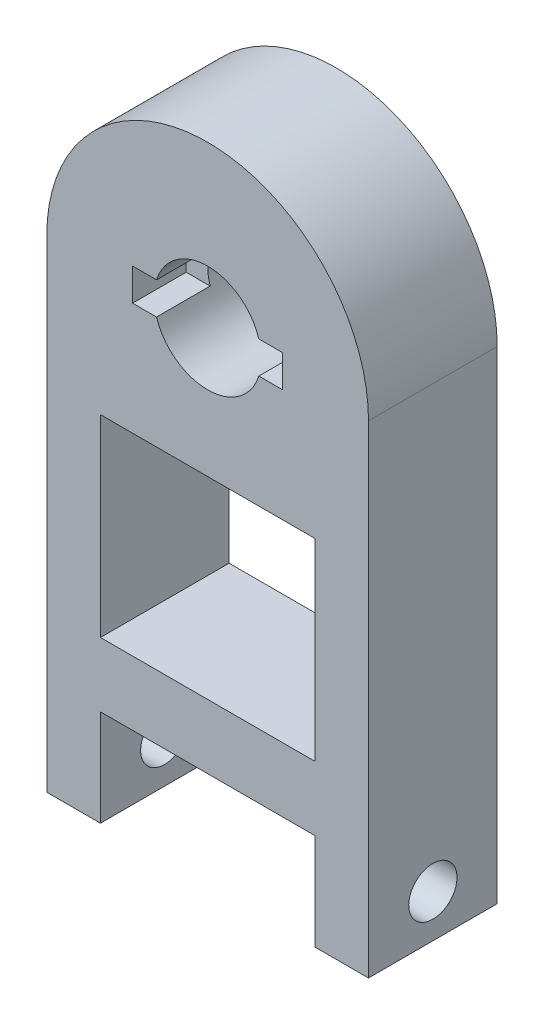
ISO-10303-21;
HEADER;
FILE_DESCRIPTION(('STEP AP214'),'2;1');
FILE_NAME('part.step','',(''),(''),'','','');
FILE_SCHEMA(('AUTOMOTIVE_DESIGN { 1 0 10303 214 1 1 1 1 }'));
ENDSEC;
DATA;
#1=APPLICATION_CONTEXT('core data for automotive mechanical design processes');
#2=APPLICATION_PROTOCOL_DEFINITION('international standard','automotive_design',2000,#1);
#3=PRODUCT_CONTEXT('',#1,'mechanical');
#4=PRODUCT('Part','Part','',(#3));
#5=PRODUCT_RELATED_PRODUCT_CATEGORY('part','',(#4));
#6=PRODUCT_DEFINITION_FORMATION('','',#4);
#7=PRODUCT_DEFINITION_CONTEXT('part definition',#1,'design');
#8=PRODUCT_DEFINITION('design','',#6,#7);
#9=PRODUCT_DEFINITION_SHAPE('','',#8);
#10=(LENGTH_UNIT() NAMED_UNIT(*) SI_UNIT(.MILLI.,.METRE.));
#11=(NAMED_UNIT(*) PLANE_ANGLE_UNIT() SI_UNIT($,.RADIAN.));
#12=(NAMED_UNIT(*) SI_UNIT($,.STERADIAN.) SOLID_ANGLE_UNIT());
#13=UNCERTAINTY_MEASURE_WITH_UNIT(LENGTH_MEASURE(1.E-05),#10,'distance_accuracy_value','');
#14=(GEOMETRIC_REPRESENTATION_CONTEXT(3) GLOBAL_UNCERTAINTY_ASSIGNED_CONTEXT((#13)) GLOBAL_UNIT_ASSIGNED_CONTEXT((#10,
#11,#12)) REPRESENTATION_CONTEXT('',''));
#15=CARTESIAN_POINT('',(0.,0.,0.));
#16=DIRECTION('',(0.,0.,1.));
#17=DIRECTION('',(1.,0.,0.));
#18=AXIS2_PLACEMENT_3D('',#15,#16,#17);
#19=CARTESIAN_POINT('',(0.,45.,12.));
#20=DIRECTION('',(0.,0.,1.));
#21=DIRECTION('',(1.,0.,0.));
#22=AXIS2_PLACEMENT_3D('',#19,#20,#21);
#23=PLANE('',#22);
#24=DIRECTION('',(-1.,0.,0.));
#25=VECTOR('',#24,1.);
#26=CARTESIAN_POINT('',(-7.,46.5,12.));
#27=LINE('',#26,#25);
#28=CARTESIAN_POINT('',(-4.76969600708473,46.5,12.));
#29=VERTEX_POINT('',#28);
#30=CARTESIAN_POINT('',(-7.,46.5,12.));
#31=VERTEX_POINT('',#30);
#32=EDGE_CURVE('E193',#29,#31,#27,.T.);
#33=ORIENTED_EDGE('',*,*,#32,.F.);
#34=CARTESIAN_POINT('',(0.,45.,12.));
#35=DIRECTION('',(0.,0.,1.));
#36=DIRECTION('',(1.,0.,0.));
#37=AXIS2_PLACEMENT_3D('',#34,#35,#36);
#38=CIRCLE('',#37,5.);
#39=CARTESIAN_POINT('',(4.76969600708473,46.5,12.));
#40=VERTEX_POINT('',#39);
#41=EDGE_CURVE('E224',#40,#29,#38,.T.);
#42=ORIENTED_EDGE('',*,*,#41,.F.);
#43=CARTESIAN_POINT('',(7.,46.5,12.));
#44=VERTEX_POINT('',#43);
#45=EDGE_CURVE('E191',#44,#40,#27,.T.);
#46=ORIENTED_EDGE('',*,*,#45,.F.);
#47=DIRECTION('',(0.,1.,0.));
#48=VECTOR('',#47,1.);
#49=CARTESIAN_POINT('',(7.,46.5,12.));
#50=LINE('',#49,#48);
#51=CARTESIAN_POINT('',(7.,43.5,12.));
#52=VERTEX_POINT('',#51);
#53=EDGE_CURVE('E202',#52,#44,#50,.T.);
#54=ORIENTED_EDGE('',*,*,#53,.F.);
#55=DIRECTION('',(1.,0.,0.));
#56=VECTOR('',#55,1.);
#57=CARTESIAN_POINT('',(-7.,43.5,12.));
#58=LINE('',#57,#56);
#59=CARTESIAN_POINT('',(4.76969600708473,43.5,12.));
#60=VERTEX_POINT('',#59);
#61=EDGE_CURVE('E199',#60,#52,#58,.T.);
#62=ORIENTED_EDGE('',*,*,#61,.F.);
#63=CARTESIAN_POINT('',(-4.76969600708473,43.5,12.));
#64=VERTEX_POINT('',#63);
#65=EDGE_CURVE('E228',#64,#60,#38,.T.);
#66=ORIENTED_EDGE('',*,*,#65,.F.);
#67=CARTESIAN_POINT('',(-7.,43.5,12.));
#68=VERTEX_POINT('',#67);
#69=EDGE_CURVE('E200',#68,#64,#58,.T.);
#70=ORIENTED_EDGE('',*,*,#69,.F.);
#71=DIRECTION('',(0.,-1.,0.));
#72=VECTOR('',#71,1.);
#73=CARTESIAN_POINT('',(-7.,46.5,12.));
#74=LINE('',#73,#72);
#75=EDGE_CURVE('E176',#31,#68,#74,.T.);
#76=ORIENTED_EDGE('',*,*,#75,.F.);
#77=EDGE_LOOP('',(#33,#42,#46,#54,#62,#66,#70,#76));
#78=FACE_BOUND('',#77,.T.);
#79=DIRECTION('',(1.,0.,0.));
#80=VECTOR('',#79,1.);
#81=CARTESIAN_POINT('',(-9.99999999999999,15.,12.));
#82=LINE('',#81,#80);
#83=CARTESIAN_POINT('',(-9.99999999999999,15.,12.));
#84=VERTEX_POINT('',#83);
#85=CARTESIAN_POINT('',(10.,15.,12.));
#86=VERTEX_POINT('',#85);
#87=EDGE_CURVE('E233',#84,#86,#82,.T.);
#88=ORIENTED_EDGE('',*,*,#87,.F.);
#89=DIRECTION('',(0.,-1.,0.));
#90=VECTOR('',#89,1.);
#91=CARTESIAN_POINT('',(-9.99999999999999,33.,12.));
#92=LINE('',#91,#90);
#93=CARTESIAN_POINT('',(-9.99999999999999,33.,12.));
#94=VERTEX_POINT('',#93);
#95=EDGE_CURVE('E231',#94,#84,#92,.T.);
#96=ORIENTED_EDGE('',*,*,#95,.F.);
#97=DIRECTION('',(-1.,0.,0.));
#98=VECTOR('',#97,1.);
#99=CARTESIAN_POINT('',(-9.99999999999999,33.,12.));
#100=LINE('',#99,#98);
#101=CARTESIAN_POINT('',(10.,33.,12.));
#102=VERTEX_POINT('',#101);
#103=EDGE_CURVE('E239',#102,#94,#100,.T.);
#104=ORIENTED_EDGE('',*,*,#103,.F.);
#105=DIRECTION('',(0.,1.,0.));
#106=VECTOR('',#105,1.);
#107=CARTESIAN_POINT('',(10.,33.,12.));
#108=LINE('',#107,#106);
#109=EDGE_CURVE('E236',#86,#102,#108,.T.);
#110=ORIENTED_EDGE('',*,*,#109,.F.);
#111=EDGE_LOOP('',(#88,#96,#104,#110));
#112=FACE_BOUND('',#111,.T.);
#113=CARTESIAN_POINT('',(0.,45.,12.));
#114=DIRECTION('',(0.,0.,1.));
#115=DIRECTION('',(1.,0.,0.));
#116=AXIS2_PLACEMENT_3D('',#113,#114,#115);
#117=CIRCLE('',#116,15.);
#118=CARTESIAN_POINT('',(15.,45.,12.));
#119=VERTEX_POINT('',#118);
#120=CARTESIAN_POINT('',(-15.,45.,12.));
#121=VERTEX_POINT('',#120);
#122=EDGE_CURVE('E262',#119,#121,#117,.T.);
#123=ORIENTED_EDGE('',*,*,#122,.T.);
#124=DIRECTION('',(0.,-1.,0.));
#125=VECTOR('',#124,1.);
#126=CARTESIAN_POINT('',(-15.,45.,12.));
#127=LINE('',#126,#125);
#128=CARTESIAN_POINT('',(-15.,0.,12.));
#129=VERTEX_POINT('',#128);
#130=EDGE_CURVE('E265',#121,#129,#127,.T.);
#131=ORIENTED_EDGE('',*,*,#130,.T.);
#132=DIRECTION('',(1.,0.,0.));
#133=VECTOR('',#132,1.);
#134=CARTESIAN_POINT('',(-15.,0.,12.));
#135=LINE('',#134,#133);
#136=CARTESIAN_POINT('',(-9.99999999999999,0.,12.));
#137=VERTEX_POINT('',#136);
#138=EDGE_CURVE('E268',#129,#137,#135,.T.);
#139=ORIENTED_EDGE('',*,*,#138,.T.);
#140=DIRECTION('',(0.,1.,0.));
#141=VECTOR('',#140,1.);
#142=CARTESIAN_POINT('',(-9.99999999999999,0.,12.));
#143=LINE('',#142,#141);
#144=CARTESIAN_POINT('',(-9.99999999999999,9.,12.));
#145=VERTEX_POINT('',#144);
#146=EDGE_CURVE('E270',#137,#145,#143,.T.);
#147=ORIENTED_EDGE('',*,*,#146,.T.);
#148=DIRECTION('',(1.,0.,0.));
#149=VECTOR('',#148,1.);
#150=CARTESIAN_POINT('',(-9.99999999999999,9.,12.));
#151=LINE('',#150,#149);
#152=CARTESIAN_POINT('',(10.,9.,12.));
#153=VERTEX_POINT('',#152);
#154=EDGE_CURVE('E272',#145,#153,#151,.T.);
#155=ORIENTED_EDGE('',*,*,#154,.T.);
#156=DIRECTION('',(0.,-1.,0.));
#157=VECTOR('',#156,1.);
#158=CARTESIAN_POINT('',(10.,9.,12.));
#159=LINE('',#158,#157);
#160=CARTESIAN_POINT('',(10.,0.,12.));
#161=VERTEX_POINT('',#160);
#162=EDGE_CURVE('E274',#153,#161,#159,.T.);
#163=ORIENTED_EDGE('',*,*,#162,.T.);
#164=DIRECTION('',(1.,0.,0.));
#165=VECTOR('',#164,1.);
#166=CARTESIAN_POINT('',(10.,0.,12.));
#167=LINE('',#166,#165);
#168=CARTESIAN_POINT('',(15.,0.,12.));
#169=VERTEX_POINT('',#168);
#170=EDGE_CURVE('E276',#161,#169,#167,.T.);
#171=ORIENTED_EDGE('',*,*,#170,.T.);
#172=DIRECTION('',(0.,1.,0.));
#173=VECTOR('',#172,1.);
#174=CARTESIAN_POINT('',(15.,45.,12.));
#175=LINE('',#174,#173);
#176=EDGE_CURVE('E278',#169,#119,#175,.T.);
#177=ORIENTED_EDGE('',*,*,#176,.T.);
#178=EDGE_LOOP('',(#123,#131,#139,#147,#155,#163,#171,#177));
#179=FACE_BOUND('',#178,.T.);
#180=ADVANCED_FACE('F33',(#78,#112,#179),#23,.T.);
#181=CARTESIAN_POINT('',(0.,45.,0.));
#182=DIRECTION('',(0.,0.,1.));
#183=DIRECTION('',(1.,0.,0.));
#184=AXIS2_PLACEMENT_3D('',#181,#182,#183);
#185=PLANE('',#184);
#186=CARTESIAN_POINT('',(0.,45.,0.));
#187=DIRECTION('',(0.,0.,1.));
#188=DIRECTION('',(1.,0.,0.));
#189=AXIS2_PLACEMENT_3D('',#186,#187,#188);
#190=CIRCLE('',#189,15.);
#191=CARTESIAN_POINT('',(15.,45.,0.));
#192=VERTEX_POINT('',#191);
#193=CARTESIAN_POINT('',(-15.,45.,0.));
#194=VERTEX_POINT('',#193);
#195=EDGE_CURVE('E261',#192,#194,#190,.T.);
#196=ORIENTED_EDGE('',*,*,#195,.F.);
#197=DIRECTION('',(0.,1.,0.));
#198=VECTOR('',#197,1.);
#199=CARTESIAN_POINT('',(15.,45.,0.));
#200=LINE('',#199,#198);
#201=CARTESIAN_POINT('',(15.,0.,0.));
#202=VERTEX_POINT('',#201);
#203=EDGE_CURVE('E266',#202,#192,#200,.T.);
#204=ORIENTED_EDGE('',*,*,#203,.F.);
#205=DIRECTION('',(1.,0.,0.));
#206=VECTOR('',#205,1.);
#207=CARTESIAN_POINT('',(10.,0.,0.));
#208=LINE('',#207,#206);
#209=CARTESIAN_POINT('',(10.,0.,0.));
#210=VERTEX_POINT('',#209);
#211=EDGE_CURVE('E293',#210,#202,#208,.T.);
#212=ORIENTED_EDGE('',*,*,#211,.F.);
#213=DIRECTION('',(0.,-1.,0.));
#214=VECTOR('',#213,1.);
#215=CARTESIAN_POINT('',(10.,9.,0.));
#216=LINE('',#215,#214);
#217=CARTESIAN_POINT('',(10.,9.,0.));
#218=VERTEX_POINT('',#217);
#219=EDGE_CURVE('E291',#218,#210,#216,.T.);
#220=ORIENTED_EDGE('',*,*,#219,.F.);
#221=DIRECTION('',(1.,0.,0.));
#222=VECTOR('',#221,1.);
#223=CARTESIAN_POINT('',(-9.99999999999999,9.,0.));
#224=LINE('',#223,#222);
#225=CARTESIAN_POINT('',(-9.99999999999999,9.,0.));
#226=VERTEX_POINT('',#225);
#227=EDGE_CURVE('E289',#226,#218,#224,.T.);
#228=ORIENTED_EDGE('',*,*,#227,.F.);
#229=DIRECTION('',(0.,1.,0.));
#230=VECTOR('',#229,1.);
#231=CARTESIAN_POINT('',(-9.99999999999999,0.,0.));
#232=LINE('',#231,#230);
#233=CARTESIAN_POINT('',(-9.99999999999999,0.,0.));
#234=VERTEX_POINT('',#233);
#235=EDGE_CURVE('E287',#234,#226,#232,.T.);
#236=ORIENTED_EDGE('',*,*,#235,.F.);
#237=DIRECTION('',(1.,0.,0.));
#238=VECTOR('',#237,1.);
#239=CARTESIAN_POINT('',(-15.,0.,0.));
#240=LINE('',#239,#238);
#241=CARTESIAN_POINT('',(-15.,0.,0.));
#242=VERTEX_POINT('',#241);
#243=EDGE_CURVE('E285',#242,#234,#240,.T.);
#244=ORIENTED_EDGE('',*,*,#243,.F.);
#245=DIRECTION('',(0.,-1.,0.));
#246=VECTOR('',#245,1.);
#247=CARTESIAN_POINT('',(-15.,45.,0.));
#248=LINE('',#247,#246);
#249=EDGE_CURVE('E283',#194,#242,#248,.T.);
#250=ORIENTED_EDGE('',*,*,#249,.F.);
#251=EDGE_LOOP('',(#196,#204,#212,#220,#228,#236,#244,#250));
#252=FACE_BOUND('',#251,.T.);
#253=DIRECTION('',(0.,-1.,0.));
#254=VECTOR('',#253,1.);
#255=CARTESIAN_POINT('',(-9.99999999999999,33.,0.));
#256=LINE('',#255,#254);
#257=CARTESIAN_POINT('',(-9.99999999999999,33.,0.));
#258=VERTEX_POINT('',#257);
#259=CARTESIAN_POINT('',(-9.99999999999999,15.,0.));
#260=VERTEX_POINT('',#259);
#261=EDGE_CURVE('E227',#258,#260,#256,.T.);
#262=ORIENTED_EDGE('',*,*,#261,.T.);
#263=DIRECTION('',(1.,0.,0.));
#264=VECTOR('',#263,1.);
#265=CARTESIAN_POINT('',(-9.99999999999999,15.,0.));
#266=LINE('',#265,#264);
#267=CARTESIAN_POINT('',(10.,15.,0.));
#268=VERTEX_POINT('',#267);
#269=EDGE_CURVE('E244',#260,#268,#266,.T.);
#270=ORIENTED_EDGE('',*,*,#269,.T.);
#271=DIRECTION('',(0.,1.,0.));
#272=VECTOR('',#271,1.);
#273=CARTESIAN_POINT('',(10.,33.,0.));
#274=LINE('',#273,#272);
#275=CARTESIAN_POINT('',(10.,33.,0.));
#276=VERTEX_POINT('',#275);
#277=EDGE_CURVE('E247',#268,#276,#274,.T.);
#278=ORIENTED_EDGE('',*,*,#277,.T.);
#279=DIRECTION('',(-1.,0.,0.));
#280=VECTOR('',#279,1.);
#281=CARTESIAN_POINT('',(-9.99999999999999,33.,0.));
#282=LINE('',#281,#280);
#283=EDGE_CURVE('E234',#276,#258,#282,.T.);
#284=ORIENTED_EDGE('',*,*,#283,.T.);
#285=EDGE_LOOP('',(#262,#270,#278,#284));
#286=FACE_BOUND('',#285,.T.);
#287=CARTESIAN_POINT('',(0.,45.,0.));
#288=DIRECTION('',(0.,0.,1.));
#289=DIRECTION('',(1.,0.,0.));
#290=AXIS2_PLACEMENT_3D('',#287,#288,#289);
#291=CIRCLE('',#290,5.);
#292=CARTESIAN_POINT('',(5.,45.,0.));
#293=VERTEX_POINT('',#292);
#294=EDGE_CURVE('E223',#293,#293,#291,.T.);
#295=ORIENTED_EDGE('',*,*,#294,.T.);
#296=EDGE_LOOP('',(#295));
#297=FACE_BOUND('',#296,.T.);
#298=ADVANCED_FACE('F362',(#252,#286,#297),#185,.F.);
#299=CARTESIAN_POINT('',(0.,45.,12.));
#300=DIRECTION('',(0.,0.,-1.));
#301=DIRECTION('',(-1.,0.,0.));
#302=AXIS2_PLACEMENT_3D('',#299,#300,#301);
#303=CYLINDRICAL_SURFACE('',#302,15.);
#304=ORIENTED_EDGE('',*,*,#195,.T.);
#305=DIRECTION('',(0.,0.,-1.));
#306=VECTOR('',#305,1.);
#307=CARTESIAN_POINT('',(-15.,45.,12.));
#308=LINE('',#307,#306);
#309=EDGE_CURVE('E316',#121,#194,#308,.T.);
#310=ORIENTED_EDGE('',*,*,#309,.F.);
#311=ORIENTED_EDGE('',*,*,#122,.F.);
#312=DIRECTION('',(0.,0.,-1.));
#313=VECTOR('',#312,1.);
#314=CARTESIAN_POINT('',(15.,45.,12.));
#315=LINE('',#314,#313);
#316=EDGE_CURVE('E280',#119,#192,#315,.T.);
#317=ORIENTED_EDGE('',*,*,#316,.T.);
#318=EDGE_LOOP('',(#304,#310,#311,#317));
#319=FACE_BOUND('',#318,.T.);
#320=ADVANCED_FACE('F35',(#319),#303,.T.);
#321=CARTESIAN_POINT('',(-15.,45.,12.));
#322=DIRECTION('',(1.,0.,0.));
#323=DIRECTION('',(0.,1.,0.));
#324=AXIS2_PLACEMENT_3D('',#321,#322,#323);
#325=PLANE('',#324);
#326=CARTESIAN_POINT('',(-15.,4.,6.));
#327=DIRECTION('',(-1.,0.,0.));
#328=DIRECTION('',(0.,-1.,0.));
#329=AXIS2_PLACEMENT_3D('',#326,#327,#328);
#330=CIRCLE('',#329,2.25);
#331=CARTESIAN_POINT('',(-15.,1.75,6.));
#332=VERTEX_POINT('',#331);
#333=EDGE_CURVE('E207',#332,#332,#330,.T.);
#334=ORIENTED_EDGE('',*,*,#333,.F.);
#335=EDGE_LOOP('',(#334));
#336=FACE_BOUND('',#335,.T.);
#337=ORIENTED_EDGE('',*,*,#249,.T.);
#338=DIRECTION('',(0.,0.,-1.));
#339=VECTOR('',#338,1.);
#340=CARTESIAN_POINT('',(-15.,0.,12.));
#341=LINE('',#340,#339);
#342=EDGE_CURVE('E313',#129,#242,#341,.T.);
#343=ORIENTED_EDGE('',*,*,#342,.F.);
#344=ORIENTED_EDGE('',*,*,#130,.F.);
#345=ORIENTED_EDGE('',*,*,#309,.T.);
#346=EDGE_LOOP('',(#337,#343,#344,#345));
#347=FACE_BOUND('',#346,.T.);
#348=ADVANCED_FACE('F395',(#336,#347),#325,.F.);
#349=CARTESIAN_POINT('',(-15.,0.,12.));
#350=DIRECTION('',(0.,1.,0.));
#351=DIRECTION('',(0.,0.,1.));
#352=AXIS2_PLACEMENT_3D('',#349,#350,#351);
#353=PLANE('',#352);
#354=ORIENTED_EDGE('',*,*,#243,.T.);
#355=DIRECTION('',(0.,0.,-1.));
#356=VECTOR('',#355,1.);
#357=CARTESIAN_POINT('',(-9.99999999999999,0.,12.));
#358=LINE('',#357,#356);
#359=EDGE_CURVE('E310',#137,#234,#358,.T.);
#360=ORIENTED_EDGE('',*,*,#359,.F.);
#361=ORIENTED_EDGE('',*,*,#138,.F.);
#362=ORIENTED_EDGE('',*,*,#342,.T.);
#363=EDGE_LOOP('',(#354,#360,#361,#362));
#364=FACE_BOUND('',#363,.T.);
#365=ADVANCED_FACE('F392',(#364),#353,.F.);
#366=CARTESIAN_POINT('',(-9.99999999999999,0.,12.));
#367=DIRECTION('',(-1.,0.,0.));
#368=DIRECTION('',(0.,-1.,0.));
#369=AXIS2_PLACEMENT_3D('',#366,#367,#368);
#370=PLANE('',#369);
#371=CARTESIAN_POINT('',(-10.,4.,6.));
#372=DIRECTION('',(-1.,0.,0.));
#373=DIRECTION('',(0.,-1.,0.));
#374=AXIS2_PLACEMENT_3D('',#371,#372,#373);
#375=CIRCLE('',#374,2.25);
#376=CARTESIAN_POINT('',(-10.,1.75,6.));
#377=VERTEX_POINT('',#376);
#378=EDGE_CURVE('E220',#377,#377,#375,.T.);
#379=ORIENTED_EDGE('',*,*,#378,.T.);
#380=EDGE_LOOP('',(#379));
#381=FACE_BOUND('',#380,.T.);
#382=ORIENTED_EDGE('',*,*,#235,.T.);
#383=DIRECTION('',(0.,0.,-1.));
#384=VECTOR('',#383,1.);
#385=CARTESIAN_POINT('',(-9.99999999999999,9.,12.));
#386=LINE('',#385,#384);
#387=EDGE_CURVE('E307',#145,#226,#386,.T.);
#388=ORIENTED_EDGE('',*,*,#387,.F.);
#389=ORIENTED_EDGE('',*,*,#146,.F.);
#390=ORIENTED_EDGE('',*,*,#359,.T.);
#391=EDGE_LOOP('',(#382,#388,#389,#390));
#392=FACE_BOUND('',#391,.T.);
#393=ADVANCED_FACE('F388',(#381,#392),#370,.F.);
#394=CARTESIAN_POINT('',(-9.99999999999999,9.,12.));
#395=DIRECTION('',(0.,1.,0.));
#396=DIRECTION('',(0.,0.,1.));
#397=AXIS2_PLACEMENT_3D('',#394,#395,#396);
#398=PLANE('',#397);
#399=ORIENTED_EDGE('',*,*,#227,.T.);
#400=DIRECTION('',(0.,0.,-1.));
#401=VECTOR('',#400,1.);
#402=CARTESIAN_POINT('',(10.,9.,12.));
#403=LINE('',#402,#401);
#404=EDGE_CURVE('E304',#153,#218,#403,.T.);
#405=ORIENTED_EDGE('',*,*,#404,.F.);
#406=ORIENTED_EDGE('',*,*,#154,.F.);
#407=ORIENTED_EDGE('',*,*,#387,.T.);
#408=EDGE_LOOP('',(#399,#405,#406,#407));
#409=FACE_BOUND('',#408,.T.);
#410=ADVANCED_FACE('F384',(#409),#398,.F.);
#411=CARTESIAN_POINT('',(10.,9.,12.));
#412=DIRECTION('',(1.,0.,0.));
#413=DIRECTION('',(0.,0.,-1.));
#414=AXIS2_PLACEMENT_3D('',#411,#412,#413);
#415=PLANE('',#414);
#416=CARTESIAN_POINT('',(10.,4.,6.));
#417=DIRECTION('',(1.,0.,0.));
#418=DIRECTION('',(0.,0.,-1.));
#419=AXIS2_PLACEMENT_3D('',#416,#417,#418);
#420=CIRCLE('',#419,2.25);
#421=CARTESIAN_POINT('',(10.,4.,3.75));
#422=VERTEX_POINT('',#421);
#423=EDGE_CURVE('E215',#422,#422,#420,.T.);
#424=ORIENTED_EDGE('',*,*,#423,.T.);
#425=EDGE_LOOP('',(#424));
#426=FACE_BOUND('',#425,.T.);
#427=ORIENTED_EDGE('',*,*,#219,.T.);
#428=DIRECTION('',(0.,0.,-1.));
#429=VECTOR('',#428,1.);
#430=CARTESIAN_POINT('',(10.,0.,12.));
#431=LINE('',#430,#429);
#432=EDGE_CURVE('E301',#161,#210,#431,.T.);
#433=ORIENTED_EDGE('',*,*,#432,.F.);
#434=ORIENTED_EDGE('',*,*,#162,.F.);
#435=ORIENTED_EDGE('',*,*,#404,.T.);
#436=EDGE_LOOP('',(#427,#433,#434,#435));
#437=FACE_BOUND('',#436,.T.);
#438=ADVANCED_FACE('F380',(#426,#437),#415,.F.);
#439=CARTESIAN_POINT('',(10.,0.,12.));
#440=DIRECTION('',(0.,1.,0.));
#441=DIRECTION('',(0.,0.,1.));
#442=AXIS2_PLACEMENT_3D('',#439,#440,#441);
#443=PLANE('',#442);
#444=ORIENTED_EDGE('',*,*,#211,.T.);
#445=DIRECTION('',(0.,0.,-1.));
#446=VECTOR('',#445,1.);
#447=CARTESIAN_POINT('',(15.,0.,12.));
#448=LINE('',#447,#446);
#449=EDGE_CURVE('E298',#169,#202,#448,.T.);
#450=ORIENTED_EDGE('',*,*,#449,.F.);
#451=ORIENTED_EDGE('',*,*,#170,.F.);
#452=ORIENTED_EDGE('',*,*,#432,.T.);
#453=EDGE_LOOP('',(#444,#450,#451,#452));
#454=FACE_BOUND('',#453,.T.);
#455=ADVANCED_FACE('F376',(#454),#443,.F.);
#456=CARTESIAN_POINT('',(15.,45.,12.));
#457=DIRECTION('',(-1.,0.,0.));
#458=DIRECTION('',(0.,-1.,0.));
#459=AXIS2_PLACEMENT_3D('',#456,#457,#458);
#460=PLANE('',#459);
#461=CARTESIAN_POINT('',(15.,4.,6.));
#462=DIRECTION('',(-1.,0.,0.));
#463=DIRECTION('',(0.,-1.,0.));
#464=AXIS2_PLACEMENT_3D('',#461,#462,#463);
#465=CIRCLE('',#464,2.25);
#466=CARTESIAN_POINT('',(15.,1.75,6.));
#467=VERTEX_POINT('',#466);
#468=EDGE_CURVE('E212',#467,#467,#465,.T.);
#469=ORIENTED_EDGE('',*,*,#468,.T.);
#470=EDGE_LOOP('',(#469));
#471=FACE_BOUND('',#470,.T.);
#472=ORIENTED_EDGE('',*,*,#203,.T.);
#473=ORIENTED_EDGE('',*,*,#316,.F.);
#474=ORIENTED_EDGE('',*,*,#176,.F.);
#475=ORIENTED_EDGE('',*,*,#449,.T.);
#476=EDGE_LOOP('',(#472,#473,#474,#475));
#477=FACE_BOUND('',#476,.T.);
#478=ADVANCED_FACE('F373',(#471,#477),#460,.F.);
#479=CARTESIAN_POINT('',(-9.99999999999999,33.,12.));
#480=DIRECTION('',(1.,0.,0.));
#481=DIRECTION('',(0.,0.,-1.));
#482=AXIS2_PLACEMENT_3D('',#479,#480,#481);
#483=PLANE('',#482);
#484=ORIENTED_EDGE('',*,*,#261,.F.);
#485=DIRECTION('',(0.,0.,-1.));
#486=VECTOR('',#485,1.);
#487=CARTESIAN_POINT('',(-9.99999999999999,33.,12.));
#488=LINE('',#487,#486);
#489=EDGE_CURVE('E241',#94,#258,#488,.T.);
#490=ORIENTED_EDGE('',*,*,#489,.F.);
#491=ORIENTED_EDGE('',*,*,#95,.T.);
#492=DIRECTION('',(0.,0.,-1.));
#493=VECTOR('',#492,1.);
#494=CARTESIAN_POINT('',(-9.99999999999999,15.,12.));
#495=LINE('',#494,#493);
#496=EDGE_CURVE('E258',#84,#260,#495,.T.);
#497=ORIENTED_EDGE('',*,*,#496,.T.);
#498=EDGE_LOOP('',(#484,#490,#491,#497));
#499=FACE_BOUND('',#498,.T.);
#500=ADVANCED_FACE('F370',(#499),#483,.T.);
#501=CARTESIAN_POINT('',(-9.99999999999999,15.,12.));
#502=DIRECTION('',(0.,1.,0.));
#503=DIRECTION('',(0.,0.,1.));
#504=AXIS2_PLACEMENT_3D('',#501,#502,#503);
#505=PLANE('',#504);
#506=ORIENTED_EDGE('',*,*,#269,.F.);
#507=ORIENTED_EDGE('',*,*,#496,.F.);
#508=ORIENTED_EDGE('',*,*,#87,.T.);
#509=DIRECTION('',(0.,0.,-1.));
#510=VECTOR('',#509,1.);
#511=CARTESIAN_POINT('',(10.,15.,12.));
#512=LINE('',#511,#510);
#513=EDGE_CURVE('E256',#86,#268,#512,.T.);
#514=ORIENTED_EDGE('',*,*,#513,.T.);
#515=EDGE_LOOP('',(#506,#507,#508,#514));
#516=FACE_BOUND('',#515,.T.);
#517=ADVANCED_FACE('F451',(#516),#505,.T.);
#518=CARTESIAN_POINT('',(10.,33.,12.));
#519=DIRECTION('',(-1.,0.,0.));
#520=DIRECTION('',(0.,-1.,0.));
#521=AXIS2_PLACEMENT_3D('',#518,#519,#520);
#522=PLANE('',#521);
#523=ORIENTED_EDGE('',*,*,#277,.F.);
#524=ORIENTED_EDGE('',*,*,#513,.F.);
#525=ORIENTED_EDGE('',*,*,#109,.T.);
#526=DIRECTION('',(0.,0.,-1.));
#527=VECTOR('',#526,1.);
#528=CARTESIAN_POINT('',(10.,33.,12.));
#529=LINE('',#528,#527);
#530=EDGE_CURVE('E254',#102,#276,#529,.T.);
#531=ORIENTED_EDGE('',*,*,#530,.T.);
#532=EDGE_LOOP('',(#523,#524,#525,#531));
#533=FACE_BOUND('',#532,.T.);
#534=ADVANCED_FACE('F445',(#533),#522,.T.);
#535=CARTESIAN_POINT('',(-9.99999999999999,33.,12.));
#536=DIRECTION('',(0.,-1.,0.));
#537=DIRECTION('',(0.,0.,-1.));
#538=AXIS2_PLACEMENT_3D('',#535,#536,#537);
#539=PLANE('',#538);
#540=ORIENTED_EDGE('',*,*,#283,.F.);
#541=ORIENTED_EDGE('',*,*,#530,.F.);
#542=ORIENTED_EDGE('',*,*,#103,.T.);
#543=ORIENTED_EDGE('',*,*,#489,.T.);
#544=EDGE_LOOP('',(#540,#541,#542,#543));
#545=FACE_BOUND('',#544,.T.);
#546=ADVANCED_FACE('F436',(#545),#539,.T.);
#547=CARTESIAN_POINT('',(0.,45.,12.));
#548=DIRECTION('',(0.,0.,-1.));
#549=DIRECTION('',(-1.,0.,0.));
#550=AXIS2_PLACEMENT_3D('',#547,#548,#549);
#551=CYLINDRICAL_SURFACE('',#550,5.);
#552=DIRECTION('',(0.,0.,-1.));
#553=VECTOR('',#552,1.);
#554=CARTESIAN_POINT('',(-4.76969600708473,46.5,12.));
#555=LINE('',#554,#553);
#556=CARTESIAN_POINT('',(-4.76969600708473,46.5,7.));
#557=VERTEX_POINT('',#556);
#558=EDGE_CURVE('E11',#557,#29,#555,.F.);
#559=ORIENTED_EDGE('',*,*,#558,.F.);
#560=CARTESIAN_POINT('',(0.,45.,7.));
#561=DIRECTION('',(0.,0.,1.));
#562=DIRECTION('',(1.,0.,0.));
#563=AXIS2_PLACEMENT_3D('',#560,#561,#562);
#564=CIRCLE('',#563,5.);
#565=CARTESIAN_POINT('',(-4.76969600708473,43.5,7.));
#566=VERTEX_POINT('',#565);
#567=EDGE_CURVE('E323',#557,#566,#564,.T.);
#568=ORIENTED_EDGE('',*,*,#567,.T.);
#569=DIRECTION('',(0.,0.,-1.));
#570=VECTOR('',#569,1.);
#571=CARTESIAN_POINT('',(-4.76969600708473,43.5,12.));
#572=LINE('',#571,#570);
#573=EDGE_CURVE('E41',#64,#566,#572,.T.);
#574=ORIENTED_EDGE('',*,*,#573,.F.);
#575=ORIENTED_EDGE('',*,*,#65,.T.);
#576=DIRECTION('',(0.,0.,-1.));
#577=VECTOR('',#576,1.);
#578=CARTESIAN_POINT('',(4.76969600708473,43.5,12.));
#579=LINE('',#578,#577);
#580=CARTESIAN_POINT('',(4.76969600708473,43.5,7.));
#581=VERTEX_POINT('',#580);
#582=EDGE_CURVE('E322',#581,#60,#579,.F.);
#583=ORIENTED_EDGE('',*,*,#582,.F.);
#584=CARTESIAN_POINT('',(4.76969600708473,46.5,7.));
#585=VERTEX_POINT('',#584);
#586=EDGE_CURVE('E319',#581,#585,#564,.T.);
#587=ORIENTED_EDGE('',*,*,#586,.T.);
#588=DIRECTION('',(0.,0.,-1.));
#589=VECTOR('',#588,1.);
#590=CARTESIAN_POINT('',(4.76969600708473,46.5,12.));
#591=LINE('',#590,#589);
#592=EDGE_CURVE('E325',#40,#585,#591,.T.);
#593=ORIENTED_EDGE('',*,*,#592,.F.);
#594=ORIENTED_EDGE('',*,*,#41,.T.);
#595=EDGE_LOOP('',(#559,#568,#574,#575,#583,#587,#593,#594));
#596=FACE_BOUND('',#595,.T.);
#597=ORIENTED_EDGE('',*,*,#294,.F.);
#598=EDGE_LOOP('',(#597));
#599=FACE_BOUND('',#598,.T.);
#600=ADVANCED_FACE('F328',(#596,#599),#551,.F.);
#601=CARTESIAN_POINT('',(15.,4.,6.));
#602=DIRECTION('',(-1.,0.,0.));
#603=DIRECTION('',(0.,-1.,0.));
#604=AXIS2_PLACEMENT_3D('',#601,#602,#603);
#605=CYLINDRICAL_SURFACE('',#604,2.25);
#606=ORIENTED_EDGE('',*,*,#468,.F.);
#607=EDGE_LOOP('',(#606));
#608=FACE_BOUND('',#607,.T.);
#609=ORIENTED_EDGE('',*,*,#423,.F.);
#610=EDGE_LOOP('',(#609));
#611=FACE_BOUND('',#610,.T.);
#612=ADVANCED_FACE('F435',(#608,#611),#605,.F.);
#613=ORIENTED_EDGE('',*,*,#333,.T.);
#614=EDGE_LOOP('',(#613));
#615=FACE_BOUND('',#614,.T.);
#616=ORIENTED_EDGE('',*,*,#378,.F.);
#617=EDGE_LOOP('',(#616));
#618=FACE_BOUND('',#617,.T.);
#619=ADVANCED_FACE('F442',(#615,#618),#605,.F.);
#620=CARTESIAN_POINT('',(0.,0.,7.));
#621=DIRECTION('',(0.,0.,1.));
#622=DIRECTION('',(1.,0.,0.));
#623=AXIS2_PLACEMENT_3D('',#620,#621,#622);
#624=PLANE('',#623);
#625=DIRECTION('',(1.,0.,0.));
#626=VECTOR('',#625,1.);
#627=CARTESIAN_POINT('',(-7.,43.5,7.));
#628=LINE('',#627,#626);
#629=CARTESIAN_POINT('',(7.,43.5,7.));
#630=VERTEX_POINT('',#629);
#631=EDGE_CURVE('E185',#581,#630,#628,.T.);
#632=ORIENTED_EDGE('',*,*,#631,.T.);
#633=DIRECTION('',(0.,1.,0.));
#634=VECTOR('',#633,1.);
#635=CARTESIAN_POINT('',(7.,46.5,7.));
#636=LINE('',#635,#634);
#637=CARTESIAN_POINT('',(7.,46.5,7.));
#638=VERTEX_POINT('',#637);
#639=EDGE_CURVE('E184',#630,#638,#636,.T.);
#640=ORIENTED_EDGE('',*,*,#639,.T.);
#641=DIRECTION('',(-1.,0.,0.));
#642=VECTOR('',#641,1.);
#643=CARTESIAN_POINT('',(-7.,46.5,7.));
#644=LINE('',#643,#642);
#645=EDGE_CURVE('E56',#638,#585,#644,.T.);
#646=ORIENTED_EDGE('',*,*,#645,.T.);
#647=ORIENTED_EDGE('',*,*,#586,.F.);
#648=EDGE_LOOP('',(#632,#640,#646,#647));
#649=FACE_BOUND('',#648,.T.);
#650=ADVANCED_FACE('F347',(#649),#624,.T.);
#651=CARTESIAN_POINT('',(-7.,43.5,7.));
#652=DIRECTION('',(0.,-1.,0.));
#653=DIRECTION('',(0.,0.,-1.));
#654=AXIS2_PLACEMENT_3D('',#651,#652,#653);
#655=PLANE('',#654);
#656=ORIENTED_EDGE('',*,*,#582,.T.);
#657=ORIENTED_EDGE('',*,*,#61,.T.);
#658=DIRECTION('',(0.,0.,1.));
#659=VECTOR('',#658,1.);
#660=CARTESIAN_POINT('',(7.,43.5,7.));
#661=LINE('',#660,#659);
#662=EDGE_CURVE('E179',#630,#52,#661,.T.);
#663=ORIENTED_EDGE('',*,*,#662,.F.);
#664=ORIENTED_EDGE('',*,*,#631,.F.);
#665=EDGE_LOOP('',(#656,#657,#663,#664));
#666=FACE_BOUND('',#665,.T.);
#667=ADVANCED_FACE('F344',(#666),#655,.F.);
#668=CARTESIAN_POINT('',(-7.,46.5,7.));
#669=DIRECTION('',(0.,1.,0.));
#670=DIRECTION('',(0.,0.,1.));
#671=AXIS2_PLACEMENT_3D('',#668,#669,#670);
#672=PLANE('',#671);
#673=ORIENTED_EDGE('',*,*,#592,.T.);
#674=ORIENTED_EDGE('',*,*,#645,.F.);
#675=DIRECTION('',(0.,0.,1.));
#676=VECTOR('',#675,1.);
#677=CARTESIAN_POINT('',(7.,46.5,7.));
#678=LINE('',#677,#676);
#679=EDGE_CURVE('E208',#638,#44,#678,.T.);
#680=ORIENTED_EDGE('',*,*,#679,.T.);
#681=ORIENTED_EDGE('',*,*,#45,.T.);
#682=EDGE_LOOP('',(#673,#674,#680,#681));
#683=FACE_BOUND('',#682,.T.);
#684=ADVANCED_FACE('F350',(#683),#672,.F.);
#685=CARTESIAN_POINT('',(7.,46.5,7.));
#686=DIRECTION('',(1.,0.,0.));
#687=DIRECTION('',(0.,1.,0.));
#688=AXIS2_PLACEMENT_3D('',#685,#686,#687);
#689=PLANE('',#688);
#690=ORIENTED_EDGE('',*,*,#53,.T.);
#691=ORIENTED_EDGE('',*,*,#679,.F.);
#692=ORIENTED_EDGE('',*,*,#639,.F.);
#693=ORIENTED_EDGE('',*,*,#662,.T.);
#694=EDGE_LOOP('',(#690,#691,#692,#693));
#695=FACE_BOUND('',#694,.T.);
#696=ADVANCED_FACE('F352',(#695),#689,.F.);
#697=ORIENTED_EDGE('',*,*,#573,.T.);
#698=CARTESIAN_POINT('',(-7.,43.5,7.));
#699=VERTEX_POINT('',#698);
#700=EDGE_CURVE('E48',#699,#566,#628,.T.);
#701=ORIENTED_EDGE('',*,*,#700,.F.);
#702=DIRECTION('',(0.,0.,1.));
#703=VECTOR('',#702,1.);
#704=CARTESIAN_POINT('',(-7.,43.5,7.));
#705=LINE('',#704,#703);
#706=EDGE_CURVE('E171',#699,#68,#705,.T.);
#707=ORIENTED_EDGE('',*,*,#706,.T.);
#708=ORIENTED_EDGE('',*,*,#69,.T.);
#709=EDGE_LOOP('',(#697,#701,#707,#708));
#710=FACE_BOUND('',#709,.T.);
#711=ADVANCED_FACE('F181',(#710),#655,.F.);
#712=CARTESIAN_POINT('',(-7.,46.5,7.));
#713=VERTEX_POINT('',#712);
#714=EDGE_CURVE('E189',#557,#713,#644,.T.);
#715=ORIENTED_EDGE('',*,*,#714,.T.);
#716=DIRECTION('',(0.,-1.,0.));
#717=VECTOR('',#716,1.);
#718=CARTESIAN_POINT('',(-7.,46.5,7.));
#719=LINE('',#718,#717);
#720=EDGE_CURVE('E174',#713,#699,#719,.T.);
#721=ORIENTED_EDGE('',*,*,#720,.T.);
#722=ORIENTED_EDGE('',*,*,#700,.T.);
#723=ORIENTED_EDGE('',*,*,#567,.F.);
#724=EDGE_LOOP('',(#715,#721,#722,#723));
#725=FACE_BOUND('',#724,.T.);
#726=ADVANCED_FACE('F187',(#725),#624,.T.);
#727=CARTESIAN_POINT('',(-7.,46.5,7.));
#728=DIRECTION('',(-1.,0.,0.));
#729=DIRECTION('',(0.,0.,1.));
#730=AXIS2_PLACEMENT_3D('',#727,#728,#729);
#731=PLANE('',#730);
#732=ORIENTED_EDGE('',*,*,#75,.T.);
#733=ORIENTED_EDGE('',*,*,#706,.F.);
#734=ORIENTED_EDGE('',*,*,#720,.F.);
#735=DIRECTION('',(0.,0.,1.));
#736=VECTOR('',#735,1.);
#737=CARTESIAN_POINT('',(-7.,46.5,7.));
#738=LINE('',#737,#736);
#739=EDGE_CURVE('E205',#713,#31,#738,.T.);
#740=ORIENTED_EDGE('',*,*,#739,.T.);
#741=EDGE_LOOP('',(#732,#733,#734,#740));
#742=FACE_BOUND('',#741,.T.);
#743=ADVANCED_FACE('F172',(#742),#731,.F.);
#744=ORIENTED_EDGE('',*,*,#558,.T.);
#745=ORIENTED_EDGE('',*,*,#32,.T.);
#746=ORIENTED_EDGE('',*,*,#739,.F.);
#747=ORIENTED_EDGE('',*,*,#714,.F.);
#748=EDGE_LOOP('',(#744,#745,#746,#747));
#749=FACE_BOUND('',#748,.T.);
#750=ADVANCED_FACE('F333',(#749),#672,.F.);
#751=CLOSED_SHELL('',(#180,#298,#320,#348,#365,#393,#410,#438,#455,#478,#500,#517,#534,#546,
#600,#612,#619,#650,#667,#684,#696,#711,#726,#743,#750));
#752=MANIFOLD_SOLID_BREP('B2',#751);
#753=ADVANCED_BREP_SHAPE_REPRESENTATION('',(#18,#752),#14);
#754=SHAPE_DEFINITION_REPRESENTATION(#9,#753);
ENDSEC;
END-ISO-10303-21;
